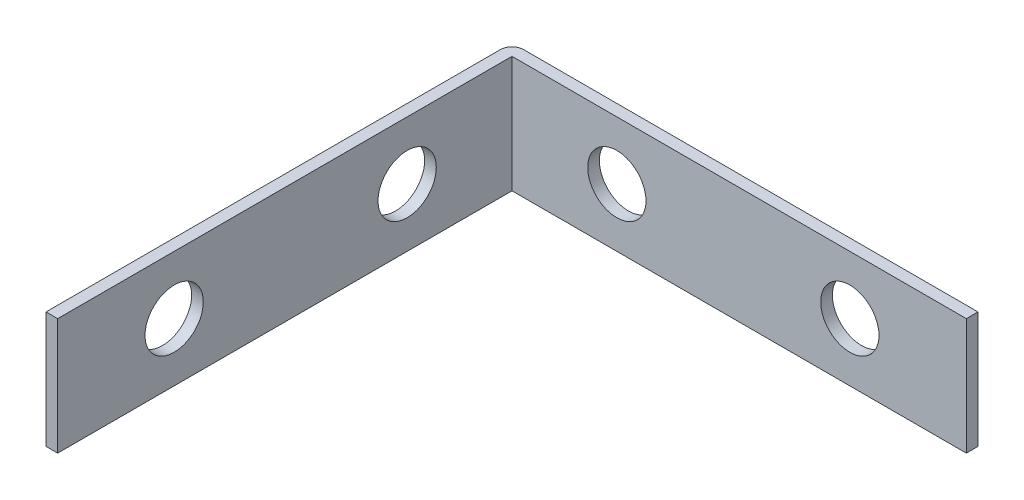
ISO-10303-21;
HEADER;
FILE_DESCRIPTION(('STEP AP214'),'2;1');
FILE_NAME('part.step','',(''),(''),'','','');
FILE_SCHEMA(('AUTOMOTIVE_DESIGN { 1 0 10303 214 1 1 1 1 }'));
ENDSEC;
DATA;
#1=APPLICATION_CONTEXT('core data for automotive mechanical design processes');
#2=APPLICATION_PROTOCOL_DEFINITION('international standard','automotive_design',2000,#1);
#3=PRODUCT_CONTEXT('',#1,'mechanical');
#4=PRODUCT('Part','Part','',(#3));
#5=PRODUCT_RELATED_PRODUCT_CATEGORY('part','',(#4));
#6=PRODUCT_DEFINITION_FORMATION('','',#4);
#7=PRODUCT_DEFINITION_CONTEXT('part definition',#1,'design');
#8=PRODUCT_DEFINITION('design','',#6,#7);
#9=PRODUCT_DEFINITION_SHAPE('','',#8);
#10=(LENGTH_UNIT() NAMED_UNIT(*) SI_UNIT(.MILLI.,.METRE.));
#11=(NAMED_UNIT(*) PLANE_ANGLE_UNIT() SI_UNIT($,.RADIAN.));
#12=(NAMED_UNIT(*) SI_UNIT($,.STERADIAN.) SOLID_ANGLE_UNIT());
#13=UNCERTAINTY_MEASURE_WITH_UNIT(LENGTH_MEASURE(1.E-05),#10,'distance_accuracy_value','');
#14=(GEOMETRIC_REPRESENTATION_CONTEXT(3) GLOBAL_UNCERTAINTY_ASSIGNED_CONTEXT((#13)) GLOBAL_UNIT_ASSIGNED_CONTEXT((#10,
#11,#12)) REPRESENTATION_CONTEXT('',''));
#15=CARTESIAN_POINT('',(0.,0.,0.));
#16=DIRECTION('',(0.,0.,1.));
#17=DIRECTION('',(1.,0.,0.));
#18=AXIS2_PLACEMENT_3D('',#15,#16,#17);
#19=CARTESIAN_POINT('',(-24.4467549531151,10.,-16.7592563589313));
#20=DIRECTION('',(0.,-1.,0.));
#21=DIRECTION('',(0.,0.,-1.));
#22=AXIS2_PLACEMENT_3D('',#19,#20,#21);
#23=CYLINDRICAL_SURFACE('',#22,1.);
#24=CARTESIAN_POINT('',(-24.4467549531151,0.,-16.7592563589313));
#25=DIRECTION('',(0.,1.,0.));
#26=DIRECTION('',(0.,0.,1.));
#27=AXIS2_PLACEMENT_3D('',#24,#25,#26);
#28=CIRCLE('',#27,1.);
#29=CARTESIAN_POINT('',(-25.4467549531151,0.,-16.7592563589313));
#30=VERTEX_POINT('',#29);
#31=CARTESIAN_POINT('',(-24.4467549531151,0.,-17.7592563589313));
#32=VERTEX_POINT('',#31);
#33=EDGE_CURVE('E120',#30,#32,#28,.F.);
#34=ORIENTED_EDGE('',*,*,#33,.F.);
#35=DIRECTION('',(0.,-1.,0.));
#36=VECTOR('',#35,1.);
#37=CARTESIAN_POINT('',(-25.4467549531151,10.,-16.7592563589313));
#38=LINE('',#37,#36);
#39=CARTESIAN_POINT('',(-25.4467549531151,10.,-16.7592563589313));
#40=VERTEX_POINT('',#39);
#41=EDGE_CURVE('E11',#40,#30,#38,.T.);
#42=ORIENTED_EDGE('',*,*,#41,.F.);
#43=CARTESIAN_POINT('',(-24.4467549531151,10.,-16.7592563589313));
#44=DIRECTION('',(0.,1.,0.));
#45=DIRECTION('',(0.,0.,1.));
#46=AXIS2_PLACEMENT_3D('',#43,#44,#45);
#47=CIRCLE('',#46,1.);
#48=CARTESIAN_POINT('',(-24.4467549531151,10.,-17.7592563589313));
#49=VERTEX_POINT('',#48);
#50=EDGE_CURVE('E134',#40,#49,#47,.F.);
#51=ORIENTED_EDGE('',*,*,#50,.T.);
#52=DIRECTION('',(0.,-1.,0.));
#53=VECTOR('',#52,1.);
#54=CARTESIAN_POINT('',(-24.4467549531151,10.,-17.7592563589313));
#55=LINE('',#54,#53);
#56=EDGE_CURVE('E81',#49,#32,#55,.T.);
#57=ORIENTED_EDGE('',*,*,#56,.T.);
#58=EDGE_LOOP('',(#34,#42,#51,#57));
#59=FACE_BOUND('',#58,.T.);
#60=ADVANCED_FACE('F33',(#59),#23,.T.);
#61=CARTESIAN_POINT('',(-25.4467549531151,10.,0.));
#62=DIRECTION('',(1.,0.,0.));
#63=DIRECTION('',(0.,0.,-1.));
#64=AXIS2_PLACEMENT_3D('',#61,#62,#63);
#65=PLANE('',#64);
#66=CARTESIAN_POINT('',(-25.4467549531151,5.,-7.75925635893127));
#67=DIRECTION('',(1.,0.,0.));
#68=DIRECTION('',(0.,0.,-1.));
#69=AXIS2_PLACEMENT_3D('',#66,#67,#68);
#70=CIRCLE('',#69,2.5);
#71=CARTESIAN_POINT('',(-25.4467549531151,5.,-10.2592563589313));
#72=VERTEX_POINT('',#71);
#73=EDGE_CURVE('E177',#72,#72,#70,.F.);
#74=ORIENTED_EDGE('',*,*,#73,.F.);
#75=EDGE_LOOP('',(#74));
#76=FACE_BOUND('',#75,.T.);
#77=CARTESIAN_POINT('',(-25.4467549531151,5.,12.2407436410687));
#78=DIRECTION('',(1.,0.,0.));
#79=DIRECTION('',(0.,0.,-1.));
#80=AXIS2_PLACEMENT_3D('',#77,#78,#79);
#81=CIRCLE('',#80,2.5);
#82=CARTESIAN_POINT('',(-25.4467549531151,5.,9.74074364106873));
#83=VERTEX_POINT('',#82);
#84=EDGE_CURVE('E171',#83,#83,#81,.F.);
#85=ORIENTED_EDGE('',*,*,#84,.F.);
#86=EDGE_LOOP('',(#85));
#87=FACE_BOUND('',#86,.T.);
#88=DIRECTION('',(0.,0.,1.));
#89=VECTOR('',#88,1.);
#90=CARTESIAN_POINT('',(-25.4467549531151,0.,0.));
#91=LINE('',#90,#89);
#92=CARTESIAN_POINT('',(-25.4467549531151,0.,22.2407436410687));
#93=VERTEX_POINT('',#92);
#94=EDGE_CURVE('E123',#30,#93,#91,.T.);
#95=ORIENTED_EDGE('',*,*,#94,.T.);
#96=DIRECTION('',(0.,-1.,0.));
#97=VECTOR('',#96,1.);
#98=CARTESIAN_POINT('',(-25.4467549531151,10.,22.2407436410687));
#99=LINE('',#98,#97);
#100=CARTESIAN_POINT('',(-25.4467549531151,10.,22.2407436410687));
#101=VERTEX_POINT('',#100);
#102=EDGE_CURVE('E41',#101,#93,#99,.T.);
#103=ORIENTED_EDGE('',*,*,#102,.F.);
#104=DIRECTION('',(0.,0.,1.));
#105=VECTOR('',#104,1.);
#106=CARTESIAN_POINT('',(-25.4467549531151,10.,0.));
#107=LINE('',#106,#105);
#108=EDGE_CURVE('E155',#40,#101,#107,.T.);
#109=ORIENTED_EDGE('',*,*,#108,.F.);
#110=ORIENTED_EDGE('',*,*,#41,.T.);
#111=EDGE_LOOP('',(#95,#103,#109,#110));
#112=FACE_BOUND('',#111,.T.);
#113=ADVANCED_FACE('F206',(#76,#87,#112),#65,.F.);
#114=CARTESIAN_POINT('',(0.,10.,22.2407436410687));
#115=DIRECTION('',(0.,0.,-1.));
#116=DIRECTION('',(-1.,0.,0.));
#117=AXIS2_PLACEMENT_3D('',#114,#115,#116);
#118=PLANE('',#117);
#119=DIRECTION('',(1.,0.,0.));
#120=VECTOR('',#119,1.);
#121=CARTESIAN_POINT('',(0.,0.,22.2407436410687));
#122=LINE('',#121,#120);
#123=CARTESIAN_POINT('',(-24.4467549531151,0.,22.2407436410687));
#124=VERTEX_POINT('',#123);
#125=EDGE_CURVE('E126',#93,#124,#122,.T.);
#126=ORIENTED_EDGE('',*,*,#125,.T.);
#127=DIRECTION('',(0.,-1.,0.));
#128=VECTOR('',#127,1.);
#129=CARTESIAN_POINT('',(-24.4467549531151,10.,22.2407436410687));
#130=LINE('',#129,#128);
#131=CARTESIAN_POINT('',(-24.4467549531151,10.,22.2407436410687));
#132=VERTEX_POINT('',#131);
#133=EDGE_CURVE('E138',#132,#124,#130,.T.);
#134=ORIENTED_EDGE('',*,*,#133,.F.);
#135=DIRECTION('',(1.,0.,0.));
#136=VECTOR('',#135,1.);
#137=CARTESIAN_POINT('',(0.,10.,22.2407436410687));
#138=LINE('',#137,#136);
#139=EDGE_CURVE('E147',#101,#132,#138,.T.);
#140=ORIENTED_EDGE('',*,*,#139,.F.);
#141=ORIENTED_EDGE('',*,*,#102,.T.);
#142=EDGE_LOOP('',(#126,#134,#140,#141));
#143=FACE_BOUND('',#142,.T.);
#144=ADVANCED_FACE('F145',(#143),#118,.F.);
#145=CARTESIAN_POINT('',(-24.4467549531151,10.,0.));
#146=DIRECTION('',(-1.,0.,0.));
#147=DIRECTION('',(0.,0.,1.));
#148=AXIS2_PLACEMENT_3D('',#145,#146,#147);
#149=PLANE('',#148);
#150=CARTESIAN_POINT('',(-24.4467549531151,5.,-7.75925635893127));
#151=DIRECTION('',(1.,0.,0.));
#152=DIRECTION('',(0.,0.,-1.));
#153=AXIS2_PLACEMENT_3D('',#150,#151,#152);
#154=CIRCLE('',#153,2.5);
#155=CARTESIAN_POINT('',(-24.4467549531151,5.,-10.2592563589313));
#156=VERTEX_POINT('',#155);
#157=EDGE_CURVE('E180',#156,#156,#154,.T.);
#158=ORIENTED_EDGE('',*,*,#157,.F.);
#159=EDGE_LOOP('',(#158));
#160=FACE_BOUND('',#159,.T.);
#161=CARTESIAN_POINT('',(-24.4467549531151,5.,12.2407436410687));
#162=DIRECTION('',(1.,0.,0.));
#163=DIRECTION('',(0.,0.,-1.));
#164=AXIS2_PLACEMENT_3D('',#161,#162,#163);
#165=CIRCLE('',#164,2.5);
#166=CARTESIAN_POINT('',(-24.4467549531151,5.,9.74074364106873));
#167=VERTEX_POINT('',#166);
#168=EDGE_CURVE('E174',#167,#167,#165,.T.);
#169=ORIENTED_EDGE('',*,*,#168,.F.);
#170=EDGE_LOOP('',(#169));
#171=FACE_BOUND('',#170,.T.);
#172=DIRECTION('',(0.,0.,-1.));
#173=VECTOR('',#172,1.);
#174=CARTESIAN_POINT('',(-24.4467549531151,0.,0.));
#175=LINE('',#174,#173);
#176=CARTESIAN_POINT('',(-24.4467549531151,0.,-16.7592563589313));
#177=VERTEX_POINT('',#176);
#178=EDGE_CURVE('E128',#124,#177,#175,.T.);
#179=ORIENTED_EDGE('',*,*,#178,.T.);
#180=DIRECTION('',(0.,-1.,0.));
#181=VECTOR('',#180,1.);
#182=CARTESIAN_POINT('',(-24.4467549531151,10.,-16.7592563589313));
#183=LINE('',#182,#181);
#184=CARTESIAN_POINT('',(-24.4467549531151,10.,-16.7592563589313));
#185=VERTEX_POINT('',#184);
#186=EDGE_CURVE('E112',#185,#177,#183,.T.);
#187=ORIENTED_EDGE('',*,*,#186,.F.);
#188=DIRECTION('',(0.,0.,-1.));
#189=VECTOR('',#188,1.);
#190=CARTESIAN_POINT('',(-24.4467549531151,10.,0.));
#191=LINE('',#190,#189);
#192=EDGE_CURVE('E103',#132,#185,#191,.T.);
#193=ORIENTED_EDGE('',*,*,#192,.F.);
#194=ORIENTED_EDGE('',*,*,#133,.T.);
#195=EDGE_LOOP('',(#179,#187,#193,#194));
#196=FACE_BOUND('',#195,.T.);
#197=ADVANCED_FACE('F154',(#160,#171,#196),#149,.F.);
#198=CARTESIAN_POINT('',(0.,10.,-16.7592563589313));
#199=DIRECTION('',(0.,0.,-1.));
#200=DIRECTION('',(-1.,0.,0.));
#201=AXIS2_PLACEMENT_3D('',#198,#199,#200);
#202=PLANE('',#201);
#203=CARTESIAN_POINT('',(-15.4467549531151,5.,-16.7592563589313));
#204=DIRECTION('',(0.,0.,1.));
#205=DIRECTION('',(1.,0.,0.));
#206=AXIS2_PLACEMENT_3D('',#203,#204,#205);
#207=CIRCLE('',#206,2.5);
#208=CARTESIAN_POINT('',(-12.9467549531151,5.,-16.7592563589313));
#209=VERTEX_POINT('',#208);
#210=EDGE_CURVE('E168',#209,#209,#207,.T.);
#211=ORIENTED_EDGE('',*,*,#210,.F.);
#212=EDGE_LOOP('',(#211));
#213=FACE_BOUND('',#212,.T.);
#214=CARTESIAN_POINT('',(4.55324504688492,5.,-16.7592563589313));
#215=DIRECTION('',(0.,0.,1.));
#216=DIRECTION('',(1.,0.,0.));
#217=AXIS2_PLACEMENT_3D('',#214,#215,#216);
#218=CIRCLE('',#217,2.5);
#219=CARTESIAN_POINT('',(7.05324504688492,5.,-16.7592563589313));
#220=VERTEX_POINT('',#219);
#221=EDGE_CURVE('E162',#220,#220,#218,.T.);
#222=ORIENTED_EDGE('',*,*,#221,.F.);
#223=EDGE_LOOP('',(#222));
#224=FACE_BOUND('',#223,.T.);
#225=DIRECTION('',(1.,0.,0.));
#226=VECTOR('',#225,1.);
#227=CARTESIAN_POINT('',(0.,0.,-16.7592563589313));
#228=LINE('',#227,#226);
#229=CARTESIAN_POINT('',(14.5532450468849,0.,-16.7592563589313));
#230=VERTEX_POINT('',#229);
#231=EDGE_CURVE('E111',#177,#230,#228,.T.);
#232=ORIENTED_EDGE('',*,*,#231,.T.);
#233=DIRECTION('',(0.,-1.,0.));
#234=VECTOR('',#233,1.);
#235=CARTESIAN_POINT('',(14.5532450468849,10.,-16.7592563589313));
#236=LINE('',#235,#234);
#237=CARTESIAN_POINT('',(14.5532450468849,10.,-16.7592563589313));
#238=VERTEX_POINT('',#237);
#239=EDGE_CURVE('E108',#238,#230,#236,.T.);
#240=ORIENTED_EDGE('',*,*,#239,.F.);
#241=DIRECTION('',(1.,0.,0.));
#242=VECTOR('',#241,1.);
#243=CARTESIAN_POINT('',(0.,10.,-16.7592563589313));
#244=LINE('',#243,#242);
#245=EDGE_CURVE('E97',#185,#238,#244,.T.);
#246=ORIENTED_EDGE('',*,*,#245,.F.);
#247=ORIENTED_EDGE('',*,*,#186,.T.);
#248=EDGE_LOOP('',(#232,#240,#246,#247));
#249=FACE_BOUND('',#248,.T.);
#250=ADVANCED_FACE('F109',(#213,#224,#249),#202,.F.);
#251=CARTESIAN_POINT('',(14.5532450468849,10.,0.));
#252=DIRECTION('',(-1.,0.,0.));
#253=DIRECTION('',(0.,0.,1.));
#254=AXIS2_PLACEMENT_3D('',#251,#252,#253);
#255=PLANE('',#254);
#256=DIRECTION('',(0.,0.,-1.));
#257=VECTOR('',#256,1.);
#258=CARTESIAN_POINT('',(14.5532450468849,0.,0.));
#259=LINE('',#258,#257);
#260=CARTESIAN_POINT('',(14.5532450468849,0.,-17.7592563589313));
#261=VERTEX_POINT('',#260);
#262=EDGE_CURVE('E74',#230,#261,#259,.T.);
#263=ORIENTED_EDGE('',*,*,#262,.T.);
#264=DIRECTION('',(0.,-1.,0.));
#265=VECTOR('',#264,1.);
#266=CARTESIAN_POINT('',(14.5532450468849,10.,-17.7592563589313));
#267=LINE('',#266,#265);
#268=CARTESIAN_POINT('',(14.5532450468849,10.,-17.7592563589313));
#269=VERTEX_POINT('',#268);
#270=EDGE_CURVE('E113',#269,#261,#267,.T.);
#271=ORIENTED_EDGE('',*,*,#270,.F.);
#272=DIRECTION('',(0.,0.,-1.));
#273=VECTOR('',#272,1.);
#274=CARTESIAN_POINT('',(14.5532450468849,10.,0.));
#275=LINE('',#274,#273);
#276=EDGE_CURVE('E101',#238,#269,#275,.T.);
#277=ORIENTED_EDGE('',*,*,#276,.F.);
#278=ORIENTED_EDGE('',*,*,#239,.T.);
#279=EDGE_LOOP('',(#263,#271,#277,#278));
#280=FACE_BOUND('',#279,.T.);
#281=ADVANCED_FACE('F115',(#280),#255,.F.);
#282=CARTESIAN_POINT('',(0.,10.,-17.7592563589313));
#283=DIRECTION('',(0.,0.,1.));
#284=DIRECTION('',(1.,0.,0.));
#285=AXIS2_PLACEMENT_3D('',#282,#283,#284);
#286=PLANE('',#285);
#287=CARTESIAN_POINT('',(-15.4467549531151,5.,-17.7592563589313));
#288=DIRECTION('',(0.,0.,1.));
#289=DIRECTION('',(1.,0.,0.));
#290=AXIS2_PLACEMENT_3D('',#287,#288,#289);
#291=CIRCLE('',#290,2.5);
#292=CARTESIAN_POINT('',(-12.9467549531151,5.,-17.7592563589313));
#293=VERTEX_POINT('',#292);
#294=EDGE_CURVE('E165',#293,#293,#291,.F.);
#295=ORIENTED_EDGE('',*,*,#294,.F.);
#296=EDGE_LOOP('',(#295));
#297=FACE_BOUND('',#296,.T.);
#298=CARTESIAN_POINT('',(4.55324504688492,5.,-17.7592563589313));
#299=DIRECTION('',(0.,0.,1.));
#300=DIRECTION('',(1.,0.,0.));
#301=AXIS2_PLACEMENT_3D('',#298,#299,#300);
#302=CIRCLE('',#301,2.5);
#303=CARTESIAN_POINT('',(7.05324504688492,5.,-17.7592563589313));
#304=VERTEX_POINT('',#303);
#305=EDGE_CURVE('E124',#304,#304,#302,.F.);
#306=ORIENTED_EDGE('',*,*,#305,.F.);
#307=EDGE_LOOP('',(#306));
#308=FACE_BOUND('',#307,.T.);
#309=DIRECTION('',(-1.,0.,0.));
#310=VECTOR('',#309,1.);
#311=CARTESIAN_POINT('',(0.,0.,-17.7592563589313));
#312=LINE('',#311,#310);
#313=EDGE_CURVE('E132',#261,#32,#312,.T.);
#314=ORIENTED_EDGE('',*,*,#313,.T.);
#315=ORIENTED_EDGE('',*,*,#56,.F.);
#316=DIRECTION('',(-1.,0.,0.));
#317=VECTOR('',#316,1.);
#318=CARTESIAN_POINT('',(0.,10.,-17.7592563589313));
#319=LINE('',#318,#317);
#320=EDGE_CURVE('E49',#269,#49,#319,.T.);
#321=ORIENTED_EDGE('',*,*,#320,.F.);
#322=ORIENTED_EDGE('',*,*,#270,.T.);
#323=EDGE_LOOP('',(#314,#315,#321,#322));
#324=FACE_BOUND('',#323,.T.);
#325=ADVANCED_FACE('F213',(#297,#308,#324),#286,.F.);
#326=CARTESIAN_POINT('',(0.,10.,0.));
#327=DIRECTION('',(0.,1.,0.));
#328=DIRECTION('',(0.,0.,1.));
#329=AXIS2_PLACEMENT_3D('',#326,#327,#328);
#330=PLANE('',#329);
#331=ORIENTED_EDGE('',*,*,#50,.F.);
#332=ORIENTED_EDGE('',*,*,#108,.T.);
#333=ORIENTED_EDGE('',*,*,#139,.T.);
#334=ORIENTED_EDGE('',*,*,#192,.T.);
#335=ORIENTED_EDGE('',*,*,#245,.T.);
#336=ORIENTED_EDGE('',*,*,#276,.T.);
#337=ORIENTED_EDGE('',*,*,#320,.T.);
#338=EDGE_LOOP('',(#331,#332,#333,#334,#335,#336,#337));
#339=FACE_BOUND('',#338,.T.);
#340=ADVANCED_FACE('F99',(#339),#330,.T.);
#341=CARTESIAN_POINT('',(0.,0.,0.));
#342=DIRECTION('',(0.,1.,0.));
#343=DIRECTION('',(0.,0.,1.));
#344=AXIS2_PLACEMENT_3D('',#341,#342,#343);
#345=PLANE('',#344);
#346=ORIENTED_EDGE('',*,*,#33,.T.);
#347=ORIENTED_EDGE('',*,*,#313,.F.);
#348=ORIENTED_EDGE('',*,*,#262,.F.);
#349=ORIENTED_EDGE('',*,*,#231,.F.);
#350=ORIENTED_EDGE('',*,*,#178,.F.);
#351=ORIENTED_EDGE('',*,*,#125,.F.);
#352=ORIENTED_EDGE('',*,*,#94,.F.);
#353=EDGE_LOOP('',(#346,#347,#348,#349,#350,#351,#352));
#354=FACE_BOUND('',#353,.T.);
#355=ADVANCED_FACE('F152',(#354),#345,.F.);
#356=CARTESIAN_POINT('',(4.55324504688492,5.,-24.8303241707967));
#357=DIRECTION('',(0.,0.,1.));
#358=DIRECTION('',(1.,0.,0.));
#359=AXIS2_PLACEMENT_3D('',#356,#357,#358);
#360=CYLINDRICAL_SURFACE('',#359,2.5);
#361=ORIENTED_EDGE('',*,*,#305,.T.);
#362=EDGE_LOOP('',(#361));
#363=FACE_BOUND('',#362,.T.);
#364=ORIENTED_EDGE('',*,*,#221,.T.);
#365=EDGE_LOOP('',(#364));
#366=FACE_BOUND('',#365,.T.);
#367=ADVANCED_FACE('F202',(#363,#366),#360,.F.);
#368=CARTESIAN_POINT('',(-15.4467549531151,5.,-24.8303241707967));
#369=DIRECTION('',(0.,0.,1.));
#370=DIRECTION('',(1.,0.,0.));
#371=AXIS2_PLACEMENT_3D('',#368,#369,#370);
#372=CYLINDRICAL_SURFACE('',#371,2.5);
#373=ORIENTED_EDGE('',*,*,#294,.T.);
#374=EDGE_LOOP('',(#373));
#375=FACE_BOUND('',#374,.T.);
#376=ORIENTED_EDGE('',*,*,#210,.T.);
#377=EDGE_LOOP('',(#376));
#378=FACE_BOUND('',#377,.T.);
#379=ADVANCED_FACE('F193',(#375,#378),#372,.F.);
#380=CARTESIAN_POINT('',(-32.5178227649806,5.,12.2407436410687));
#381=DIRECTION('',(1.,0.,0.));
#382=DIRECTION('',(0.,0.,-1.));
#383=AXIS2_PLACEMENT_3D('',#380,#381,#382);
#384=CYLINDRICAL_SURFACE('',#383,2.5);
#385=ORIENTED_EDGE('',*,*,#84,.T.);
#386=EDGE_LOOP('',(#385));
#387=FACE_BOUND('',#386,.T.);
#388=ORIENTED_EDGE('',*,*,#168,.T.);
#389=EDGE_LOOP('',(#388));
#390=FACE_BOUND('',#389,.T.);
#391=ADVANCED_FACE('F191',(#387,#390),#384,.F.);
#392=CARTESIAN_POINT('',(-32.5178227649806,5.,-7.75925635893127));
#393=DIRECTION('',(1.,0.,0.));
#394=DIRECTION('',(0.,0.,-1.));
#395=AXIS2_PLACEMENT_3D('',#392,#393,#394);
#396=CYLINDRICAL_SURFACE('',#395,2.5);
#397=ORIENTED_EDGE('',*,*,#73,.T.);
#398=EDGE_LOOP('',(#397));
#399=FACE_BOUND('',#398,.T.);
#400=ORIENTED_EDGE('',*,*,#157,.T.);
#401=EDGE_LOOP('',(#400));
#402=FACE_BOUND('',#401,.T.);
#403=ADVANCED_FACE('F184',(#399,#402),#396,.F.);
#404=CLOSED_SHELL('',(#60,#113,#144,#197,#250,#281,#325,#340,#355,#367,#379,#391,#403));
#405=MANIFOLD_SOLID_BREP('B2',#404);
#406=ADVANCED_BREP_SHAPE_REPRESENTATION('',(#18,#405),#14);
#407=SHAPE_DEFINITION_REPRESENTATION(#9,#406);
ENDSEC;
END-ISO-10303-21;
